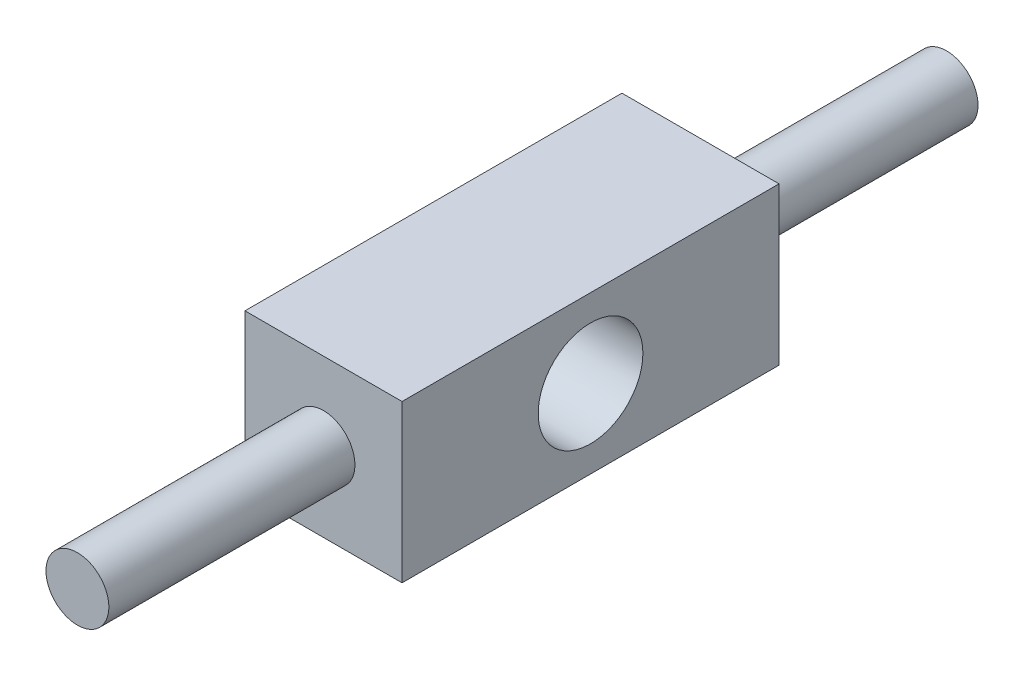
ISO-10303-21;
HEADER;
FILE_DESCRIPTION(('STEP AP214'),'2;1');
FILE_NAME('part.step','',(''),(''),'','','');
FILE_SCHEMA(('AUTOMOTIVE_DESIGN { 1 0 10303 214 1 1 1 1 }'));
ENDSEC;
DATA;
#1=APPLICATION_CONTEXT('core data for automotive mechanical design processes');
#2=APPLICATION_PROTOCOL_DEFINITION('international standard','automotive_design',2000,#1);
#3=PRODUCT_CONTEXT('',#1,'mechanical');
#4=PRODUCT('Part','Part','',(#3));
#5=PRODUCT_RELATED_PRODUCT_CATEGORY('part','',(#4));
#6=PRODUCT_DEFINITION_FORMATION('','',#4);
#7=PRODUCT_DEFINITION_CONTEXT('part definition',#1,'design');
#8=PRODUCT_DEFINITION('design','',#6,#7);
#9=PRODUCT_DEFINITION_SHAPE('','',#8);
#10=(LENGTH_UNIT() NAMED_UNIT(*) SI_UNIT(.MILLI.,.METRE.));
#11=(NAMED_UNIT(*) PLANE_ANGLE_UNIT() SI_UNIT($,.RADIAN.));
#12=(NAMED_UNIT(*) SI_UNIT($,.STERADIAN.) SOLID_ANGLE_UNIT());
#13=UNCERTAINTY_MEASURE_WITH_UNIT(LENGTH_MEASURE(1.E-05),#10,'distance_accuracy_value','');
#14=(GEOMETRIC_REPRESENTATION_CONTEXT(3) GLOBAL_UNCERTAINTY_ASSIGNED_CONTEXT((#13)) GLOBAL_UNIT_ASSIGNED_CONTEXT((#10,
#11,#12)) REPRESENTATION_CONTEXT('',''));
#15=CARTESIAN_POINT('',(0.,0.,0.));
#16=DIRECTION('',(0.,0.,1.));
#17=DIRECTION('',(1.,0.,0.));
#18=AXIS2_PLACEMENT_3D('',#15,#16,#17);
#19=CARTESIAN_POINT('',(0.,0.,180.));
#20=DIRECTION('',(0.,0.,1.));
#21=DIRECTION('',(1.,0.,0.));
#22=AXIS2_PLACEMENT_3D('',#19,#20,#21);
#23=PLANE('',#22);
#24=DIRECTION('',(0.,-1.,0.));
#25=VECTOR('',#24,1.);
#26=CARTESIAN_POINT('',(-52.6085972315659,77.2858022954763,180.));
#27=LINE('',#26,#25);
#28=CARTESIAN_POINT('',(-52.6085972315659,77.2858022954763,180.));
#29=VERTEX_POINT('',#28);
#30=CARTESIAN_POINT('',(-52.6085972315659,-72.7141977045237,180.));
#31=VERTEX_POINT('',#30);
#32=EDGE_CURVE('E79',#29,#31,#27,.T.);
#33=ORIENTED_EDGE('',*,*,#32,.T.);
#34=DIRECTION('',(1.,0.,0.));
#35=VECTOR('',#34,1.);
#36=CARTESIAN_POINT('',(-52.6085972315659,-72.7141977045237,180.));
#37=LINE('',#36,#35);
#38=CARTESIAN_POINT('',(97.3914027684341,-72.7141977045237,180.));
#39=VERTEX_POINT('',#38);
#40=EDGE_CURVE('E108',#31,#39,#37,.T.);
#41=ORIENTED_EDGE('',*,*,#40,.T.);
#42=DIRECTION('',(0.,1.,0.));
#43=VECTOR('',#42,1.);
#44=CARTESIAN_POINT('',(97.3914027684341,77.2858022954763,180.));
#45=LINE('',#44,#43);
#46=CARTESIAN_POINT('',(97.3914027684341,77.2858022954763,180.));
#47=VERTEX_POINT('',#46);
#48=EDGE_CURVE('E53',#39,#47,#45,.T.);
#49=ORIENTED_EDGE('',*,*,#48,.T.);
#50=DIRECTION('',(-1.,0.,0.));
#51=VECTOR('',#50,1.);
#52=CARTESIAN_POINT('',(-52.6085972315659,77.2858022954763,180.));
#53=LINE('',#52,#51);
#54=EDGE_CURVE('E48',#47,#29,#53,.T.);
#55=ORIENTED_EDGE('',*,*,#54,.T.);
#56=EDGE_LOOP('',(#33,#41,#49,#55));
#57=FACE_BOUND('',#56,.T.);
#58=CARTESIAN_POINT('',(22.3914027684341,2.28580229547633,180.));
#59=DIRECTION('',(0.,0.,1.));
#60=DIRECTION('',(1.,0.,0.));
#61=AXIS2_PLACEMENT_3D('',#58,#59,#60);
#62=CIRCLE('',#61,30.);
#63=CARTESIAN_POINT('',(-7.60859723156586,2.28580229547633,180.));
#64=VERTEX_POINT('',#63);
#65=EDGE_CURVE('E101',#64,#64,#62,.T.);
#66=ORIENTED_EDGE('',*,*,#65,.F.);
#67=EDGE_LOOP('',(#66));
#68=FACE_BOUND('',#67,.T.);
#69=ADVANCED_FACE('F33',(#57,#68),#23,.T.);
#70=CARTESIAN_POINT('',(-52.6085972315659,77.2858022954763,180.));
#71=DIRECTION('',(1.,0.,0.));
#72=DIRECTION('',(0.,0.,-1.));
#73=AXIS2_PLACEMENT_3D('',#70,#71,#72);
#74=PLANE('',#73);
#75=CARTESIAN_POINT('',(-52.6085972315659,2.28580229547633,0.));
#76=DIRECTION('',(1.,0.,0.));
#77=DIRECTION('',(0.,0.,-1.));
#78=AXIS2_PLACEMENT_3D('',#75,#76,#77);
#79=CIRCLE('',#78,50.);
#80=CARTESIAN_POINT('',(-52.6085972315659,2.28580229547633,-50.));
#81=VERTEX_POINT('',#80);
#82=EDGE_CURVE('E149',#81,#81,#79,.T.);
#83=ORIENTED_EDGE('',*,*,#82,.T.);
#84=EDGE_LOOP('',(#83));
#85=FACE_BOUND('',#84,.T.);
#86=DIRECTION('',(0.,0.,-1.));
#87=VECTOR('',#86,1.);
#88=CARTESIAN_POINT('',(-52.6085972315659,77.2858022954763,180.));
#89=LINE('',#88,#87);
#90=CARTESIAN_POINT('',(-52.6085972315659,77.2858022954763,-180.));
#91=VERTEX_POINT('',#90);
#92=EDGE_CURVE('E74',#29,#91,#89,.T.);
#93=ORIENTED_EDGE('',*,*,#92,.T.);
#94=DIRECTION('',(0.,-1.,0.));
#95=VECTOR('',#94,1.);
#96=CARTESIAN_POINT('',(-52.6085972315659,77.2858022954763,-180.));
#97=LINE('',#96,#95);
#98=CARTESIAN_POINT('',(-52.6085972315659,-72.7141977045237,-180.));
#99=VERTEX_POINT('',#98);
#100=EDGE_CURVE('E77',#91,#99,#97,.T.);
#101=ORIENTED_EDGE('',*,*,#100,.T.);
#102=DIRECTION('',(0.,0.,-1.));
#103=VECTOR('',#102,1.);
#104=CARTESIAN_POINT('',(-52.6085972315659,-72.7141977045237,180.));
#105=LINE('',#104,#103);
#106=EDGE_CURVE('E41',#31,#99,#105,.T.);
#107=ORIENTED_EDGE('',*,*,#106,.F.);
#108=ORIENTED_EDGE('',*,*,#32,.F.);
#109=EDGE_LOOP('',(#93,#101,#107,#108));
#110=FACE_BOUND('',#109,.T.);
#111=ADVANCED_FACE('F35',(#85,#110),#74,.F.);
#112=CARTESIAN_POINT('',(-52.6085972315659,-72.7141977045237,180.));
#113=DIRECTION('',(0.,1.,0.));
#114=DIRECTION('',(0.,0.,1.));
#115=AXIS2_PLACEMENT_3D('',#112,#113,#114);
#116=PLANE('',#115);
#117=ORIENTED_EDGE('',*,*,#106,.T.);
#118=DIRECTION('',(1.,0.,0.));
#119=VECTOR('',#118,1.);
#120=CARTESIAN_POINT('',(-52.6085972315659,-72.7141977045237,-180.));
#121=LINE('',#120,#119);
#122=CARTESIAN_POINT('',(97.3914027684341,-72.7141977045237,-180.));
#123=VERTEX_POINT('',#122);
#124=EDGE_CURVE('E91',#99,#123,#121,.T.);
#125=ORIENTED_EDGE('',*,*,#124,.T.);
#126=DIRECTION('',(0.,0.,-1.));
#127=VECTOR('',#126,1.);
#128=CARTESIAN_POINT('',(97.3914027684341,-72.7141977045237,180.));
#129=LINE('',#128,#127);
#130=EDGE_CURVE('E113',#39,#123,#129,.T.);
#131=ORIENTED_EDGE('',*,*,#130,.F.);
#132=ORIENTED_EDGE('',*,*,#40,.F.);
#133=EDGE_LOOP('',(#117,#125,#131,#132));
#134=FACE_BOUND('',#133,.T.);
#135=ADVANCED_FACE('F115',(#134),#116,.F.);
#136=CARTESIAN_POINT('',(97.3914027684341,77.2858022954763,180.));
#137=DIRECTION('',(-1.,0.,0.));
#138=DIRECTION('',(0.,0.,1.));
#139=AXIS2_PLACEMENT_3D('',#136,#137,#138);
#140=PLANE('',#139);
#141=CARTESIAN_POINT('',(97.3914027684341,2.28580229547633,0.));
#142=DIRECTION('',(1.,0.,0.));
#143=DIRECTION('',(0.,0.,-1.));
#144=AXIS2_PLACEMENT_3D('',#141,#142,#143);
#145=CIRCLE('',#144,50.);
#146=CARTESIAN_POINT('',(97.3914027684341,2.28580229547633,-50.));
#147=VERTEX_POINT('',#146);
#148=EDGE_CURVE('E151',#147,#147,#145,.T.);
#149=ORIENTED_EDGE('',*,*,#148,.F.);
#150=EDGE_LOOP('',(#149));
#151=FACE_BOUND('',#150,.T.);
#152=ORIENTED_EDGE('',*,*,#130,.T.);
#153=DIRECTION('',(0.,1.,0.));
#154=VECTOR('',#153,1.);
#155=CARTESIAN_POINT('',(97.3914027684341,77.2858022954763,-180.));
#156=LINE('',#155,#154);
#157=CARTESIAN_POINT('',(97.3914027684341,77.2858022954763,-180.));
#158=VERTEX_POINT('',#157);
#159=EDGE_CURVE('E95',#123,#158,#156,.T.);
#160=ORIENTED_EDGE('',*,*,#159,.T.);
#161=DIRECTION('',(0.,0.,-1.));
#162=VECTOR('',#161,1.);
#163=CARTESIAN_POINT('',(97.3914027684341,77.2858022954763,180.));
#164=LINE('',#163,#162);
#165=EDGE_CURVE('E82',#47,#158,#164,.T.);
#166=ORIENTED_EDGE('',*,*,#165,.F.);
#167=ORIENTED_EDGE('',*,*,#48,.F.);
#168=EDGE_LOOP('',(#152,#160,#166,#167));
#169=FACE_BOUND('',#168,.T.);
#170=ADVANCED_FACE('F133',(#151,#169),#140,.F.);
#171=CARTESIAN_POINT('',(-52.6085972315659,77.2858022954763,180.));
#172=DIRECTION('',(0.,-1.,0.));
#173=DIRECTION('',(0.,0.,-1.));
#174=AXIS2_PLACEMENT_3D('',#171,#172,#173);
#175=PLANE('',#174);
#176=ORIENTED_EDGE('',*,*,#165,.T.);
#177=DIRECTION('',(-1.,0.,0.));
#178=VECTOR('',#177,1.);
#179=CARTESIAN_POINT('',(-52.6085972315659,77.2858022954763,-180.));
#180=LINE('',#179,#178);
#181=EDGE_CURVE('E88',#158,#91,#180,.T.);
#182=ORIENTED_EDGE('',*,*,#181,.T.);
#183=ORIENTED_EDGE('',*,*,#92,.F.);
#184=ORIENTED_EDGE('',*,*,#54,.F.);
#185=EDGE_LOOP('',(#176,#182,#183,#184));
#186=FACE_BOUND('',#185,.T.);
#187=ADVANCED_FACE('F94',(#186),#175,.F.);
#188=CARTESIAN_POINT('',(22.3914027684341,2.28580229547633,415.));
#189=DIRECTION('',(0.,0.,-1.));
#190=DIRECTION('',(-1.,0.,0.));
#191=AXIS2_PLACEMENT_3D('',#188,#189,#190);
#192=CYLINDRICAL_SURFACE('',#191,30.);
#193=CARTESIAN_POINT('',(22.3914027684341,2.28580229547633,415.));
#194=DIRECTION('',(0.,0.,1.));
#195=DIRECTION('',(1.,0.,0.));
#196=AXIS2_PLACEMENT_3D('',#193,#194,#195);
#197=CIRCLE('',#196,30.);
#198=CARTESIAN_POINT('',(-7.60859723156586,2.28580229547633,415.));
#199=VERTEX_POINT('',#198);
#200=EDGE_CURVE('E102',#199,#199,#197,.T.);
#201=CARTESIAN_POINT('',(-7.60859723156586,2.28580229547633,415.));
#202=CARTESIAN_POINT('',(-7.60859723156586,2.28580229547633,412.552083333333));
#203=CARTESIAN_POINT('',(-7.60859723156586,2.28580229547633,410.104166666667));
#204=CARTESIAN_POINT('',(-7.60859723156586,2.28580229547633,405.208333333333));
#205=CARTESIAN_POINT('',(-7.60859723156586,2.28580229547633,402.760416666667));
#206=CARTESIAN_POINT('',(-7.60859723156586,2.28580229547633,397.864583333333));
#207=CARTESIAN_POINT('',(-7.60859723156586,2.28580229547633,395.416666666667));
#208=CARTESIAN_POINT('',(-7.60859723156586,2.28580229547633,390.520833333333));
#209=CARTESIAN_POINT('',(-7.60859723156586,2.28580229547633,388.072916666667));
#210=CARTESIAN_POINT('',(-7.60859723156586,2.28580229547633,383.177083333333));
#211=CARTESIAN_POINT('',(-7.60859723156586,2.28580229547633,380.729166666667));
#212=CARTESIAN_POINT('',(-7.60859723156586,2.28580229547633,375.833333333333));
#213=CARTESIAN_POINT('',(-7.60859723156586,2.28580229547633,373.385416666667));
#214=CARTESIAN_POINT('',(-7.60859723156586,2.28580229547633,368.489583333333));
#215=CARTESIAN_POINT('',(-7.60859723156586,2.28580229547633,366.041666666667));
#216=CARTESIAN_POINT('',(-7.60859723156586,2.28580229547633,361.145833333333));
#217=CARTESIAN_POINT('',(-7.60859723156586,2.28580229547633,358.697916666667));
#218=CARTESIAN_POINT('',(-7.60859723156586,2.28580229547633,353.802083333333));
#219=CARTESIAN_POINT('',(-7.60859723156586,2.28580229547633,351.354166666667));
#220=CARTESIAN_POINT('',(-7.60859723156586,2.28580229547633,346.458333333333));
#221=CARTESIAN_POINT('',(-7.60859723156586,2.28580229547633,344.010416666667));
#222=CARTESIAN_POINT('',(-7.60859723156586,2.28580229547633,339.114583333333));
#223=CARTESIAN_POINT('',(-7.60859723156586,2.28580229547633,336.666666666667));
#224=CARTESIAN_POINT('',(-7.60859723156586,2.28580229547633,331.770833333333));
#225=CARTESIAN_POINT('',(-7.60859723156586,2.28580229547633,329.322916666667));
#226=CARTESIAN_POINT('',(-7.60859723156586,2.28580229547633,324.427083333333));
#227=CARTESIAN_POINT('',(-7.60859723156586,2.28580229547633,321.979166666667));
#228=CARTESIAN_POINT('',(-7.60859723156586,2.28580229547633,317.083333333333));
#229=CARTESIAN_POINT('',(-7.60859723156586,2.28580229547633,314.635416666667));
#230=CARTESIAN_POINT('',(-7.60859723156586,2.28580229547633,309.739583333333));
#231=CARTESIAN_POINT('',(-7.60859723156586,2.28580229547633,307.291666666667));
#232=CARTESIAN_POINT('',(-7.60859723156586,2.28580229547633,302.395833333333));
#233=CARTESIAN_POINT('',(-7.60859723156586,2.28580229547633,299.947916666667));
#234=CARTESIAN_POINT('',(-7.60859723156586,2.28580229547633,295.052083333333));
#235=CARTESIAN_POINT('',(-7.60859723156586,2.28580229547633,292.604166666667));
#236=CARTESIAN_POINT('',(-7.60859723156586,2.28580229547633,287.708333333333));
#237=CARTESIAN_POINT('',(-7.60859723156586,2.28580229547633,285.260416666667));
#238=CARTESIAN_POINT('',(-7.60859723156586,2.28580229547633,280.364583333333));
#239=CARTESIAN_POINT('',(-7.60859723156586,2.28580229547633,277.916666666667));
#240=CARTESIAN_POINT('',(-7.60859723156586,2.28580229547633,273.020833333333));
#241=CARTESIAN_POINT('',(-7.60859723156586,2.28580229547633,270.572916666667));
#242=CARTESIAN_POINT('',(-7.60859723156586,2.28580229547633,265.677083333333));
#243=CARTESIAN_POINT('',(-7.60859723156586,2.28580229547633,263.229166666667));
#244=CARTESIAN_POINT('',(-7.60859723156586,2.28580229547633,258.333333333333));
#245=CARTESIAN_POINT('',(-7.60859723156586,2.28580229547633,255.885416666667));
#246=CARTESIAN_POINT('',(-7.60859723156586,2.28580229547633,250.989583333333));
#247=CARTESIAN_POINT('',(-7.60859723156586,2.28580229547633,248.541666666667));
#248=CARTESIAN_POINT('',(-7.60859723156586,2.28580229547633,243.645833333333));
#249=CARTESIAN_POINT('',(-7.60859723156586,2.28580229547633,241.197916666667));
#250=CARTESIAN_POINT('',(-7.60859723156586,2.28580229547633,236.302083333333));
#251=CARTESIAN_POINT('',(-7.60859723156586,2.28580229547633,233.854166666667));
#252=CARTESIAN_POINT('',(-7.60859723156586,2.28580229547633,228.958333333333));
#253=CARTESIAN_POINT('',(-7.60859723156586,2.28580229547633,226.510416666667));
#254=CARTESIAN_POINT('',(-7.60859723156586,2.28580229547633,221.614583333333));
#255=CARTESIAN_POINT('',(-7.60859723156586,2.28580229547633,219.166666666667));
#256=CARTESIAN_POINT('',(-7.60859723156586,2.28580229547633,214.270833333333));
#257=CARTESIAN_POINT('',(-7.60859723156586,2.28580229547633,211.822916666667));
#258=CARTESIAN_POINT('',(-7.60859723156586,2.28580229547633,206.927083333333));
#259=CARTESIAN_POINT('',(-7.60859723156586,2.28580229547633,204.479166666667));
#260=CARTESIAN_POINT('',(-7.60859723156586,2.28580229547633,199.583333333333));
#261=CARTESIAN_POINT('',(-7.60859723156586,2.28580229547633,197.135416666667));
#262=CARTESIAN_POINT('',(-7.60859723156586,2.28580229547633,192.239583333333));
#263=CARTESIAN_POINT('',(-7.60859723156586,2.28580229547633,189.791666666667));
#264=CARTESIAN_POINT('',(-7.60859723156586,2.28580229547633,184.895833333333));
#265=CARTESIAN_POINT('',(-7.60859723156586,2.28580229547633,182.447916666667));
#266=CARTESIAN_POINT('',(-7.60859723156586,2.28580229547633,180.));
#267=B_SPLINE_CURVE_WITH_KNOTS('',3,(#201,#202,#203,#204,#205,#206,#207,#208,#209,#210,#211,
#212,#213,#214,#215,#216,#217,#218,#219,#220,#221,#222,#223,#224,#225,#226,#227,#228,#229,#230,
#231,#232,#233,#234,#235,#236,#237,#238,#239,#240,#241,#242,#243,#244,#245,#246,#247,#248,#249,
#250,#251,#252,#253,#254,#255,#256,#257,#258,#259,#260,#261,#262,#263,#264,#265,#266),
.UNSPECIFIED.,.F.,.F.,(4,2,2,2,2,2,2,2,2,2,2,2,2,2,2,2,2,2,2,2,2,2,2,2,2,2,2,2,2,2,2,2,4),(0.,
7.34374999999998,14.6875,22.0312499999999,29.375,36.71875,44.0625,51.40625,58.75,66.09375,
73.4374999999999,80.78125,88.125,95.46875,102.8125,110.15625,117.5,124.84375,132.1875,139.53125,
146.875,154.21875,161.5625,168.90625,176.25,183.59375,190.9375,198.28125,205.625,212.96875,
220.3125,227.65625,235.),.UNSPECIFIED.);
#268=EDGE_CURVE('BSEAM122',#199,#64,#267,.T.);
#269=ORIENTED_EDGE('',*,*,#200,.F.);
#270=ORIENTED_EDGE('',*,*,#65,.T.);
#271=ORIENTED_EDGE('',*,*,#268,.T.);
#272=ORIENTED_EDGE('',*,*,#268,.F.);
#273=EDGE_LOOP('',(#269,#271,#270,#272));
#274=FACE_BOUND('',#273,.T.);
#275=ADVANCED_FACE('F122',(#274),#192,.T.);
#276=CARTESIAN_POINT('',(22.3914027684341,2.28580229547633,415.));
#277=DIRECTION('',(0.,0.,1.));
#278=DIRECTION('',(1.,0.,0.));
#279=AXIS2_PLACEMENT_3D('',#276,#277,#278);
#280=PLANE('',#279);
#281=ORIENTED_EDGE('',*,*,#200,.T.);
#282=EDGE_LOOP('',(#281));
#283=FACE_BOUND('',#282,.T.);
#284=ADVANCED_FACE('F124',(#283),#280,.T.);
#285=CARTESIAN_POINT('',(0.,0.,-180.));
#286=DIRECTION('',(0.,0.,-1.));
#287=DIRECTION('',(1.,0.,0.));
#288=AXIS2_PLACEMENT_3D('',#285,#286,#287);
#289=PLANE('',#288);
#290=CARTESIAN_POINT('',(22.3914027684341,2.28580229547633,-180.));
#291=DIRECTION('',(0.,0.,-1.));
#292=DIRECTION('',(-1.,0.,0.));
#293=AXIS2_PLACEMENT_3D('',#290,#291,#292);
#294=CIRCLE('',#293,30.);
#295=CARTESIAN_POINT('',(52.3914027684341,2.28580229547633,-180.));
#296=VERTEX_POINT('',#295);
#297=EDGE_CURVE('E11',#296,#296,#294,.T.);
#298=ORIENTED_EDGE('',*,*,#297,.F.);
#299=EDGE_LOOP('',(#298));
#300=FACE_BOUND('',#299,.T.);
#301=ORIENTED_EDGE('',*,*,#100,.F.);
#302=ORIENTED_EDGE('',*,*,#181,.F.);
#303=ORIENTED_EDGE('',*,*,#159,.F.);
#304=ORIENTED_EDGE('',*,*,#124,.F.);
#305=EDGE_LOOP('',(#301,#302,#303,#304));
#306=FACE_BOUND('',#305,.T.);
#307=ADVANCED_FACE('F86',(#300,#306),#289,.T.);
#308=CARTESIAN_POINT('',(22.3914027684341,2.28580229547633,-415.));
#309=DIRECTION('',(0.,0.,1.));
#310=DIRECTION('',(1.,0.,0.));
#311=AXIS2_PLACEMENT_3D('',#308,#309,#310);
#312=CYLINDRICAL_SURFACE('',#311,30.);
#313=CARTESIAN_POINT('',(22.3914027684341,2.28580229547633,-415.));
#314=DIRECTION('',(0.,0.,1.));
#315=DIRECTION('',(1.,0.,0.));
#316=AXIS2_PLACEMENT_3D('',#313,#314,#315);
#317=CIRCLE('',#316,30.);
#318=CARTESIAN_POINT('',(52.3914027684341,2.28580229547633,-415.));
#319=VERTEX_POINT('',#318);
#320=EDGE_CURVE('E92',#319,#319,#317,.T.);
#321=CARTESIAN_POINT('',(52.3914027684341,2.28580229547633,-415.));
#322=CARTESIAN_POINT('',(52.3914027684341,2.28580229547633,-412.552083333333));
#323=CARTESIAN_POINT('',(52.3914027684341,2.28580229547633,-410.104166666667));
#324=CARTESIAN_POINT('',(52.3914027684341,2.28580229547633,-405.208333333333));
#325=CARTESIAN_POINT('',(52.3914027684341,2.28580229547633,-402.760416666667));
#326=CARTESIAN_POINT('',(52.3914027684341,2.28580229547633,-397.864583333333));
#327=CARTESIAN_POINT('',(52.3914027684341,2.28580229547633,-395.416666666667));
#328=CARTESIAN_POINT('',(52.3914027684341,2.28580229547633,-390.520833333333));
#329=CARTESIAN_POINT('',(52.3914027684341,2.28580229547633,-388.072916666667));
#330=CARTESIAN_POINT('',(52.3914027684341,2.28580229547633,-383.177083333333));
#331=CARTESIAN_POINT('',(52.3914027684341,2.28580229547633,-380.729166666667));
#332=CARTESIAN_POINT('',(52.3914027684341,2.28580229547633,-375.833333333333));
#333=CARTESIAN_POINT('',(52.3914027684341,2.28580229547633,-373.385416666667));
#334=CARTESIAN_POINT('',(52.3914027684341,2.28580229547633,-368.489583333333));
#335=CARTESIAN_POINT('',(52.3914027684341,2.28580229547633,-366.041666666667));
#336=CARTESIAN_POINT('',(52.3914027684341,2.28580229547633,-361.145833333333));
#337=CARTESIAN_POINT('',(52.3914027684341,2.28580229547633,-358.697916666667));
#338=CARTESIAN_POINT('',(52.3914027684341,2.28580229547633,-353.802083333333));
#339=CARTESIAN_POINT('',(52.3914027684341,2.28580229547633,-351.354166666667));
#340=CARTESIAN_POINT('',(52.3914027684341,2.28580229547633,-346.458333333333));
#341=CARTESIAN_POINT('',(52.3914027684341,2.28580229547633,-344.010416666667));
#342=CARTESIAN_POINT('',(52.3914027684341,2.28580229547633,-339.114583333333));
#343=CARTESIAN_POINT('',(52.3914027684341,2.28580229547633,-336.666666666667));
#344=CARTESIAN_POINT('',(52.3914027684341,2.28580229547633,-331.770833333333));
#345=CARTESIAN_POINT('',(52.3914027684341,2.28580229547633,-329.322916666667));
#346=CARTESIAN_POINT('',(52.3914027684341,2.28580229547633,-324.427083333333));
#347=CARTESIAN_POINT('',(52.3914027684341,2.28580229547633,-321.979166666667));
#348=CARTESIAN_POINT('',(52.3914027684341,2.28580229547633,-317.083333333333));
#349=CARTESIAN_POINT('',(52.3914027684341,2.28580229547633,-314.635416666667));
#350=CARTESIAN_POINT('',(52.3914027684341,2.28580229547633,-309.739583333333));
#351=CARTESIAN_POINT('',(52.3914027684341,2.28580229547633,-307.291666666667));
#352=CARTESIAN_POINT('',(52.3914027684341,2.28580229547633,-302.395833333333));
#353=CARTESIAN_POINT('',(52.3914027684341,2.28580229547633,-299.947916666667));
#354=CARTESIAN_POINT('',(52.3914027684341,2.28580229547633,-295.052083333333));
#355=CARTESIAN_POINT('',(52.3914027684341,2.28580229547633,-292.604166666667));
#356=CARTESIAN_POINT('',(52.3914027684341,2.28580229547633,-287.708333333333));
#357=CARTESIAN_POINT('',(52.3914027684341,2.28580229547633,-285.260416666667));
#358=CARTESIAN_POINT('',(52.3914027684341,2.28580229547633,-280.364583333333));
#359=CARTESIAN_POINT('',(52.3914027684341,2.28580229547633,-277.916666666667));
#360=CARTESIAN_POINT('',(52.3914027684341,2.28580229547633,-273.020833333333));
#361=CARTESIAN_POINT('',(52.3914027684341,2.28580229547633,-270.572916666667));
#362=CARTESIAN_POINT('',(52.3914027684341,2.28580229547633,-265.677083333333));
#363=CARTESIAN_POINT('',(52.3914027684341,2.28580229547633,-263.229166666667));
#364=CARTESIAN_POINT('',(52.3914027684341,2.28580229547633,-258.333333333333));
#365=CARTESIAN_POINT('',(52.3914027684341,2.28580229547633,-255.885416666667));
#366=CARTESIAN_POINT('',(52.3914027684341,2.28580229547633,-250.989583333333));
#367=CARTESIAN_POINT('',(52.3914027684341,2.28580229547633,-248.541666666667));
#368=CARTESIAN_POINT('',(52.3914027684341,2.28580229547633,-243.645833333333));
#369=CARTESIAN_POINT('',(52.3914027684341,2.28580229547633,-241.197916666667));
#370=CARTESIAN_POINT('',(52.3914027684341,2.28580229547633,-236.302083333333));
#371=CARTESIAN_POINT('',(52.3914027684341,2.28580229547633,-233.854166666667));
#372=CARTESIAN_POINT('',(52.3914027684341,2.28580229547633,-228.958333333333));
#373=CARTESIAN_POINT('',(52.3914027684341,2.28580229547633,-226.510416666667));
#374=CARTESIAN_POINT('',(52.3914027684341,2.28580229547633,-221.614583333333));
#375=CARTESIAN_POINT('',(52.3914027684341,2.28580229547633,-219.166666666667));
#376=CARTESIAN_POINT('',(52.3914027684341,2.28580229547633,-214.270833333333));
#377=CARTESIAN_POINT('',(52.3914027684341,2.28580229547633,-211.822916666667));
#378=CARTESIAN_POINT('',(52.3914027684341,2.28580229547633,-206.927083333333));
#379=CARTESIAN_POINT('',(52.3914027684341,2.28580229547633,-204.479166666667));
#380=CARTESIAN_POINT('',(52.3914027684341,2.28580229547633,-199.583333333333));
#381=CARTESIAN_POINT('',(52.3914027684341,2.28580229547633,-197.135416666667));
#382=CARTESIAN_POINT('',(52.3914027684341,2.28580229547633,-192.239583333333));
#383=CARTESIAN_POINT('',(52.3914027684341,2.28580229547633,-189.791666666667));
#384=CARTESIAN_POINT('',(52.3914027684341,2.28580229547633,-184.895833333333));
#385=CARTESIAN_POINT('',(52.3914027684341,2.28580229547633,-182.447916666667));
#386=CARTESIAN_POINT('',(52.3914027684341,2.28580229547633,-180.));
#387=B_SPLINE_CURVE_WITH_KNOTS('',3,(#321,#322,#323,#324,#325,#326,#327,#328,#329,#330,#331,
#332,#333,#334,#335,#336,#337,#338,#339,#340,#341,#342,#343,#344,#345,#346,#347,#348,#349,#350,
#351,#352,#353,#354,#355,#356,#357,#358,#359,#360,#361,#362,#363,#364,#365,#366,#367,#368,#369,
#370,#371,#372,#373,#374,#375,#376,#377,#378,#379,#380,#381,#382,#383,#384,#385,#386),
.UNSPECIFIED.,.F.,.F.,(4,2,2,2,2,2,2,2,2,2,2,2,2,2,2,2,2,2,2,2,2,2,2,2,2,2,2,2,2,2,2,2,4),(0.,
7.34375000000004,14.6875,22.0312500000001,29.375,36.71875,44.0625,51.40625,58.75,
66.0937500000001,73.4375,80.78125,88.125,95.46875,102.8125,110.15625,117.5,124.84375,132.1875,
139.53125,146.875,154.21875,161.5625,168.90625,176.25,183.59375,190.9375,198.28125,205.625,
212.96875,220.3125,227.65625,235.),.UNSPECIFIED.);
#388=EDGE_CURVE('BSEAM166',#319,#296,#387,.T.);
#389=ORIENTED_EDGE('',*,*,#320,.T.);
#390=ORIENTED_EDGE('',*,*,#297,.T.);
#391=ORIENTED_EDGE('',*,*,#388,.T.);
#392=ORIENTED_EDGE('',*,*,#388,.F.);
#393=EDGE_LOOP('',(#389,#391,#390,#392));
#394=FACE_BOUND('',#393,.T.);
#395=ADVANCED_FACE('F166',(#394),#312,.T.);
#396=CARTESIAN_POINT('',(22.3914027684341,2.28580229547633,-415.));
#397=DIRECTION('',(0.,0.,-1.));
#398=DIRECTION('',(1.,0.,0.));
#399=AXIS2_PLACEMENT_3D('',#396,#397,#398);
#400=PLANE('',#399);
#401=ORIENTED_EDGE('',*,*,#320,.F.);
#402=EDGE_LOOP('',(#401));
#403=FACE_BOUND('',#402,.T.);
#404=ADVANCED_FACE('F161',(#403),#400,.T.);
#405=CARTESIAN_POINT('',(-52.6085972315659,2.28580229547633,0.));
#406=DIRECTION('',(1.,0.,0.));
#407=DIRECTION('',(0.,0.,-1.));
#408=AXIS2_PLACEMENT_3D('',#405,#406,#407);
#409=CYLINDRICAL_SURFACE('',#408,50.);
#410=ORIENTED_EDGE('',*,*,#82,.F.);
#411=EDGE_LOOP('',(#410));
#412=FACE_BOUND('',#411,.T.);
#413=ORIENTED_EDGE('',*,*,#148,.T.);
#414=EDGE_LOOP('',(#413));
#415=FACE_BOUND('',#414,.T.);
#416=ADVANCED_FACE('F158',(#412,#415),#409,.F.);
#417=CLOSED_SHELL('',(#69,#111,#135,#170,#187,#275,#284,#307,#395,#404,#416));
#418=MANIFOLD_SOLID_BREP('B2',#417);
#419=ADVANCED_BREP_SHAPE_REPRESENTATION('',(#18,#418),#14);
#420=SHAPE_DEFINITION_REPRESENTATION(#9,#419);
ENDSEC;
END-ISO-10303-21;
